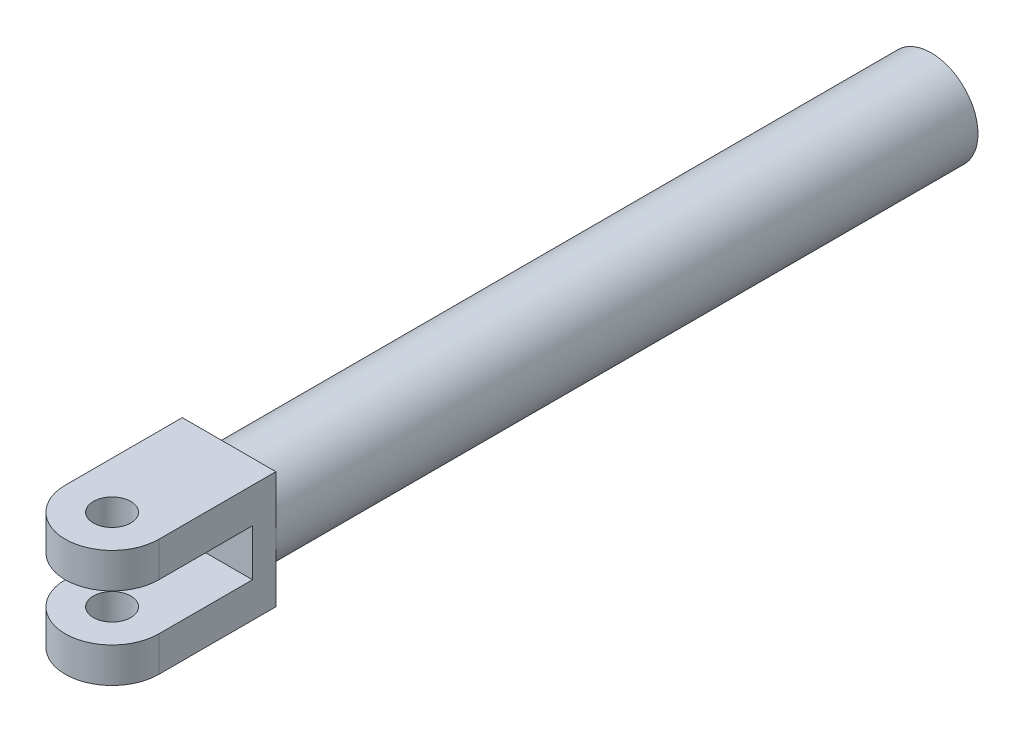
ISO-10303-21;
HEADER;
FILE_DESCRIPTION(('STEP AP214'),'2;1');
FILE_NAME('part.step','',(''),(''),'','','');
FILE_SCHEMA(('AUTOMOTIVE_DESIGN { 1 0 10303 214 1 1 1 1 }'));
ENDSEC;
DATA;
#1=APPLICATION_CONTEXT('core data for automotive mechanical design processes');
#2=APPLICATION_PROTOCOL_DEFINITION('international standard','automotive_design',2000,#1);
#3=PRODUCT_CONTEXT('',#1,'mechanical');
#4=PRODUCT('Part','Part','',(#3));
#5=PRODUCT_RELATED_PRODUCT_CATEGORY('part','',(#4));
#6=PRODUCT_DEFINITION_FORMATION('','',#4);
#7=PRODUCT_DEFINITION_CONTEXT('part definition',#1,'design');
#8=PRODUCT_DEFINITION('design','',#6,#7);
#9=PRODUCT_DEFINITION_SHAPE('','',#8);
#10=(LENGTH_UNIT() NAMED_UNIT(*) SI_UNIT(.MILLI.,.METRE.));
#11=(NAMED_UNIT(*) PLANE_ANGLE_UNIT() SI_UNIT($,.RADIAN.));
#12=(NAMED_UNIT(*) SI_UNIT($,.STERADIAN.) SOLID_ANGLE_UNIT());
#13=UNCERTAINTY_MEASURE_WITH_UNIT(LENGTH_MEASURE(1.E-05),#10,'distance_accuracy_value','');
#14=(GEOMETRIC_REPRESENTATION_CONTEXT(3) GLOBAL_UNCERTAINTY_ASSIGNED_CONTEXT((#13)) GLOBAL_UNIT_ASSIGNED_CONTEXT((#10,
#11,#12)) REPRESENTATION_CONTEXT('',''));
#15=CARTESIAN_POINT('',(0.,0.,0.));
#16=DIRECTION('',(0.,0.,1.));
#17=DIRECTION('',(1.,0.,0.));
#18=AXIS2_PLACEMENT_3D('',#15,#16,#17);
#19=CARTESIAN_POINT('',(0.,5.,175.));
#20=DIRECTION('',(0.,-1.,0.));
#21=DIRECTION('',(0.,0.,-1.));
#22=AXIS2_PLACEMENT_3D('',#19,#20,#21);
#23=CYLINDRICAL_SURFACE('',#22,10.);
#24=DIRECTION('',(0.,1.,0.));
#25=VECTOR('',#24,1.);
#26=CARTESIAN_POINT('',(-10.,5.,175.));
#27=LINE('',#26,#25);
#28=CARTESIAN_POINT('',(-10.,5.,175.));
#29=VERTEX_POINT('',#28);
#30=CARTESIAN_POINT('',(-10.,12.5,175.));
#31=VERTEX_POINT('',#30);
#32=EDGE_CURVE('E185',#29,#31,#27,.T.);
#33=ORIENTED_EDGE('',*,*,#32,.F.);
#34=CARTESIAN_POINT('',(0.,5.,175.));
#35=DIRECTION('',(0.,1.,0.));
#36=DIRECTION('',(0.,0.,1.));
#37=AXIS2_PLACEMENT_3D('',#34,#35,#36);
#38=CIRCLE('',#37,10.);
#39=CARTESIAN_POINT('',(10.,5.,175.));
#40=VERTEX_POINT('',#39);
#41=EDGE_CURVE('E46',#40,#29,#38,.F.);
#42=ORIENTED_EDGE('',*,*,#41,.F.);
#43=DIRECTION('',(0.,1.,0.));
#44=VECTOR('',#43,1.);
#45=CARTESIAN_POINT('',(10.,5.,175.));
#46=LINE('',#45,#44);
#47=CARTESIAN_POINT('',(10.,12.5,175.));
#48=VERTEX_POINT('',#47);
#49=EDGE_CURVE('E187',#48,#40,#46,.F.);
#50=ORIENTED_EDGE('',*,*,#49,.F.);
#51=CARTESIAN_POINT('',(0.,12.5,175.));
#52=DIRECTION('',(0.,-1.,0.));
#53=DIRECTION('',(0.,0.,-1.));
#54=AXIS2_PLACEMENT_3D('',#51,#52,#53);
#55=CIRCLE('',#54,10.);
#56=EDGE_CURVE('E11',#31,#48,#55,.F.);
#57=ORIENTED_EDGE('',*,*,#56,.F.);
#58=EDGE_LOOP('',(#33,#42,#50,#57));
#59=FACE_BOUND('',#58,.T.);
#60=ADVANCED_FACE('F38',(#59),#23,.T.);
#61=CARTESIAN_POINT('',(0.,-5.,175.));
#62=DIRECTION('',(0.,1.,0.));
#63=DIRECTION('',(0.,0.,1.));
#64=AXIS2_PLACEMENT_3D('',#61,#62,#63);
#65=CYLINDRICAL_SURFACE('',#64,10.);
#66=DIRECTION('',(0.,-1.,0.));
#67=VECTOR('',#66,1.);
#68=CARTESIAN_POINT('',(10.,-5.,175.));
#69=LINE('',#68,#67);
#70=CARTESIAN_POINT('',(10.,-5.,175.));
#71=VERTEX_POINT('',#70);
#72=CARTESIAN_POINT('',(10.,-12.5,175.));
#73=VERTEX_POINT('',#72);
#74=EDGE_CURVE('E168',#71,#73,#69,.T.);
#75=ORIENTED_EDGE('',*,*,#74,.F.);
#76=CARTESIAN_POINT('',(0.,-5.,175.));
#77=DIRECTION('',(0.,-1.,0.));
#78=DIRECTION('',(0.,0.,-1.));
#79=AXIS2_PLACEMENT_3D('',#76,#77,#78);
#80=CIRCLE('',#79,10.);
#81=CARTESIAN_POINT('',(-10.,-5.,175.));
#82=VERTEX_POINT('',#81);
#83=EDGE_CURVE('E181',#82,#71,#80,.F.);
#84=ORIENTED_EDGE('',*,*,#83,.F.);
#85=DIRECTION('',(0.,-1.,0.));
#86=VECTOR('',#85,1.);
#87=CARTESIAN_POINT('',(-10.,-5.,175.));
#88=LINE('',#87,#86);
#89=CARTESIAN_POINT('',(-10.,-12.5,175.));
#90=VERTEX_POINT('',#89);
#91=EDGE_CURVE('E179',#90,#82,#88,.F.);
#92=ORIENTED_EDGE('',*,*,#91,.F.);
#93=CARTESIAN_POINT('',(0.,-12.5,175.));
#94=DIRECTION('',(0.,1.,0.));
#95=DIRECTION('',(0.,0.,1.));
#96=AXIS2_PLACEMENT_3D('',#93,#94,#95);
#97=CIRCLE('',#96,10.);
#98=EDGE_CURVE('E183',#73,#90,#97,.F.);
#99=ORIENTED_EDGE('',*,*,#98,.F.);
#100=EDGE_LOOP('',(#75,#84,#92,#99));
#101=FACE_BOUND('',#100,.T.);
#102=ADVANCED_FACE('F212',(#101),#65,.T.);
#103=CARTESIAN_POINT('',(0.,0.,150.));
#104=DIRECTION('',(0.,0.,-1.));
#105=DIRECTION('',(-1.,0.,0.));
#106=AXIS2_PLACEMENT_3D('',#103,#104,#105);
#107=CYLINDRICAL_SURFACE('',#106,10.);
#108=CARTESIAN_POINT('',(0.,0.,150.));
#109=DIRECTION('',(0.,0.,1.));
#110=DIRECTION('',(1.,0.,0.));
#111=AXIS2_PLACEMENT_3D('',#108,#109,#110);
#112=CIRCLE('',#111,10.);
#113=CARTESIAN_POINT('',(10.,0.,150.));
#114=VERTEX_POINT('',#113);
#115=CARTESIAN_POINT('',(-10.,0.,150.));
#116=VERTEX_POINT('',#115);
#117=EDGE_CURVE('E165',#114,#116,#112,.T.);
#118=ORIENTED_EDGE('',*,*,#117,.F.);
#119=EDGE_CURVE('E169',#116,#114,#112,.T.);
#120=ORIENTED_EDGE('',*,*,#119,.F.);
#121=EDGE_LOOP('',(#118,#120));
#122=FACE_BOUND('',#121,.T.);
#123=CARTESIAN_POINT('',(0.,0.,0.));
#124=DIRECTION('',(0.,0.,1.));
#125=DIRECTION('',(1.,0.,0.));
#126=AXIS2_PLACEMENT_3D('',#123,#124,#125);
#127=CIRCLE('',#126,10.);
#128=CARTESIAN_POINT('',(10.,0.,0.));
#129=VERTEX_POINT('',#128);
#130=EDGE_CURVE('E164',#129,#129,#127,.T.);
#131=ORIENTED_EDGE('',*,*,#130,.T.);
#132=EDGE_LOOP('',(#131));
#133=FACE_BOUND('',#132,.T.);
#134=ADVANCED_FACE('F232',(#122,#133),#107,.T.);
#135=CARTESIAN_POINT('',(0.,0.,0.));
#136=DIRECTION('',(0.,0.,1.));
#137=DIRECTION('',(1.,0.,0.));
#138=AXIS2_PLACEMENT_3D('',#135,#136,#137);
#139=PLANE('',#138);
#140=ORIENTED_EDGE('',*,*,#130,.F.);
#141=EDGE_LOOP('',(#140));
#142=FACE_BOUND('',#141,.T.);
#143=ADVANCED_FACE('F236',(#142),#139,.F.);
#144=CARTESIAN_POINT('',(0.,0.,150.));
#145=DIRECTION('',(0.,0.,1.));
#146=DIRECTION('',(1.,0.,0.));
#147=AXIS2_PLACEMENT_3D('',#144,#145,#146);
#148=PLANE('',#147);
#149=DIRECTION('',(0.,1.,0.));
#150=VECTOR('',#149,1.);
#151=CARTESIAN_POINT('',(10.,12.5,150.));
#152=LINE('',#151,#150);
#153=CARTESIAN_POINT('',(10.,12.5,150.));
#154=VERTEX_POINT('',#153);
#155=EDGE_CURVE('E142',#114,#154,#152,.T.);
#156=ORIENTED_EDGE('',*,*,#155,.F.);
#157=ORIENTED_EDGE('',*,*,#117,.T.);
#158=DIRECTION('',(0.,-1.,0.));
#159=VECTOR('',#158,1.);
#160=CARTESIAN_POINT('',(-10.,12.5,150.));
#161=LINE('',#160,#159);
#162=CARTESIAN_POINT('',(-10.,12.5,150.));
#163=VERTEX_POINT('',#162);
#164=EDGE_CURVE('E150',#163,#116,#161,.T.);
#165=ORIENTED_EDGE('',*,*,#164,.F.);
#166=DIRECTION('',(-1.,0.,0.));
#167=VECTOR('',#166,1.);
#168=CARTESIAN_POINT('',(-10.,12.5,150.));
#169=LINE('',#168,#167);
#170=EDGE_CURVE('E146',#154,#163,#169,.T.);
#171=ORIENTED_EDGE('',*,*,#170,.F.);
#172=EDGE_LOOP('',(#156,#157,#165,#171));
#173=FACE_BOUND('',#172,.T.);
#174=ADVANCED_FACE('F197',(#173),#148,.F.);
#175=CARTESIAN_POINT('',(-10.,-12.5,150.));
#176=VERTEX_POINT('',#175);
#177=EDGE_CURVE('E149',#116,#176,#161,.T.);
#178=ORIENTED_EDGE('',*,*,#177,.F.);
#179=ORIENTED_EDGE('',*,*,#119,.T.);
#180=CARTESIAN_POINT('',(10.,-12.5,150.));
#181=VERTEX_POINT('',#180);
#182=EDGE_CURVE('E143',#181,#114,#152,.T.);
#183=ORIENTED_EDGE('',*,*,#182,.F.);
#184=DIRECTION('',(1.,0.,0.));
#185=VECTOR('',#184,1.);
#186=CARTESIAN_POINT('',(-10.,-12.5,150.));
#187=LINE('',#186,#185);
#188=EDGE_CURVE('E153',#176,#181,#187,.T.);
#189=ORIENTED_EDGE('',*,*,#188,.F.);
#190=EDGE_LOOP('',(#178,#179,#183,#189));
#191=FACE_BOUND('',#190,.T.);
#192=ADVANCED_FACE('F205',(#191),#148,.F.);
#193=CARTESIAN_POINT('',(10.,12.5,185.));
#194=DIRECTION('',(-1.,0.,0.));
#195=DIRECTION('',(0.,0.,1.));
#196=AXIS2_PLACEMENT_3D('',#193,#194,#195);
#197=PLANE('',#196);
#198=DIRECTION('',(0.,0.,-1.));
#199=VECTOR('',#198,1.);
#200=CARTESIAN_POINT('',(10.,12.5,185.));
#201=LINE('',#200,#199);
#202=EDGE_CURVE('E162',#48,#154,#201,.T.);
#203=ORIENTED_EDGE('',*,*,#202,.F.);
#204=ORIENTED_EDGE('',*,*,#49,.T.);
#205=DIRECTION('',(0.,0.,-1.));
#206=VECTOR('',#205,1.);
#207=CARTESIAN_POINT('',(10.,5.,185.));
#208=LINE('',#207,#206);
#209=CARTESIAN_POINT('',(10.,5.,155.));
#210=VERTEX_POINT('',#209);
#211=EDGE_CURVE('E135',#40,#210,#208,.T.);
#212=ORIENTED_EDGE('',*,*,#211,.T.);
#213=DIRECTION('',(0.,-1.,0.));
#214=VECTOR('',#213,1.);
#215=CARTESIAN_POINT('',(10.,12.5,155.));
#216=LINE('',#215,#214);
#217=CARTESIAN_POINT('',(10.,-5.,155.));
#218=VERTEX_POINT('',#217);
#219=EDGE_CURVE('E124',#210,#218,#216,.T.);
#220=ORIENTED_EDGE('',*,*,#219,.T.);
#221=DIRECTION('',(0.,0.,1.));
#222=VECTOR('',#221,1.);
#223=CARTESIAN_POINT('',(10.,-5.,185.));
#224=LINE('',#223,#222);
#225=EDGE_CURVE('E138',#218,#71,#224,.T.);
#226=ORIENTED_EDGE('',*,*,#225,.T.);
#227=ORIENTED_EDGE('',*,*,#74,.T.);
#228=DIRECTION('',(0.,0.,-1.));
#229=VECTOR('',#228,1.);
#230=CARTESIAN_POINT('',(10.,-12.5,185.));
#231=LINE('',#230,#229);
#232=EDGE_CURVE('E156',#73,#181,#231,.T.);
#233=ORIENTED_EDGE('',*,*,#232,.T.);
#234=ORIENTED_EDGE('',*,*,#182,.T.);
#235=ORIENTED_EDGE('',*,*,#155,.T.);
#236=EDGE_LOOP('',(#203,#204,#212,#220,#226,#227,#233,#234,#235));
#237=FACE_BOUND('',#236,.T.);
#238=ADVANCED_FACE('F190',(#237),#197,.F.);
#239=CARTESIAN_POINT('',(-10.,12.5,185.));
#240=DIRECTION('',(0.,-1.,0.));
#241=DIRECTION('',(0.,0.,-1.));
#242=AXIS2_PLACEMENT_3D('',#239,#240,#241);
#243=PLANE('',#242);
#244=CARTESIAN_POINT('',(0.,12.5,175.));
#245=DIRECTION('',(0.,-1.,0.));
#246=DIRECTION('',(0.,0.,-1.));
#247=AXIS2_PLACEMENT_3D('',#244,#245,#246);
#248=CIRCLE('',#247,4.);
#249=CARTESIAN_POINT('',(0.,12.5,171.));
#250=VERTEX_POINT('',#249);
#251=EDGE_CURVE('E115',#250,#250,#248,.T.);
#252=ORIENTED_EDGE('',*,*,#251,.T.);
#253=EDGE_LOOP('',(#252));
#254=FACE_BOUND('',#253,.T.);
#255=DIRECTION('',(0.,0.,-1.));
#256=VECTOR('',#255,1.);
#257=CARTESIAN_POINT('',(-10.,12.5,185.));
#258=LINE('',#257,#256);
#259=EDGE_CURVE('E160',#31,#163,#258,.T.);
#260=ORIENTED_EDGE('',*,*,#259,.F.);
#261=ORIENTED_EDGE('',*,*,#56,.T.);
#262=ORIENTED_EDGE('',*,*,#202,.T.);
#263=ORIENTED_EDGE('',*,*,#170,.T.);
#264=EDGE_LOOP('',(#260,#261,#262,#263));
#265=FACE_BOUND('',#264,.T.);
#266=ADVANCED_FACE('F192',(#254,#265),#243,.F.);
#267=CARTESIAN_POINT('',(-10.,12.5,185.));
#268=DIRECTION('',(1.,0.,0.));
#269=DIRECTION('',(0.,0.,-1.));
#270=AXIS2_PLACEMENT_3D('',#267,#268,#269);
#271=PLANE('',#270);
#272=DIRECTION('',(0.,0.,-1.));
#273=VECTOR('',#272,1.);
#274=CARTESIAN_POINT('',(-10.,5.,155.));
#275=LINE('',#274,#273);
#276=CARTESIAN_POINT('',(-10.,5.,155.));
#277=VERTEX_POINT('',#276);
#278=EDGE_CURVE('E106',#29,#277,#275,.T.);
#279=ORIENTED_EDGE('',*,*,#278,.F.);
#280=ORIENTED_EDGE('',*,*,#32,.T.);
#281=ORIENTED_EDGE('',*,*,#259,.T.);
#282=ORIENTED_EDGE('',*,*,#164,.T.);
#283=ORIENTED_EDGE('',*,*,#177,.T.);
#284=DIRECTION('',(0.,0.,-1.));
#285=VECTOR('',#284,1.);
#286=CARTESIAN_POINT('',(-10.,-12.5,185.));
#287=LINE('',#286,#285);
#288=EDGE_CURVE('E158',#90,#176,#287,.T.);
#289=ORIENTED_EDGE('',*,*,#288,.F.);
#290=ORIENTED_EDGE('',*,*,#91,.T.);
#291=DIRECTION('',(0.,0.,1.));
#292=VECTOR('',#291,1.);
#293=CARTESIAN_POINT('',(-10.,-5.,155.));
#294=LINE('',#293,#292);
#295=CARTESIAN_POINT('',(-10.,-5.,155.));
#296=VERTEX_POINT('',#295);
#297=EDGE_CURVE('E126',#296,#82,#294,.T.);
#298=ORIENTED_EDGE('',*,*,#297,.F.);
#299=DIRECTION('',(0.,-1.,0.));
#300=VECTOR('',#299,1.);
#301=CARTESIAN_POINT('',(-10.,5.,155.));
#302=LINE('',#301,#300);
#303=EDGE_CURVE('E114',#277,#296,#302,.T.);
#304=ORIENTED_EDGE('',*,*,#303,.F.);
#305=EDGE_LOOP('',(#279,#280,#281,#282,#283,#289,#290,#298,#304));
#306=FACE_BOUND('',#305,.T.);
#307=ADVANCED_FACE('F128',(#306),#271,.F.);
#308=CARTESIAN_POINT('',(-10.,-12.5,185.));
#309=DIRECTION('',(0.,1.,0.));
#310=DIRECTION('',(0.,0.,1.));
#311=AXIS2_PLACEMENT_3D('',#308,#309,#310);
#312=PLANE('',#311);
#313=CARTESIAN_POINT('',(0.,-12.5,175.));
#314=DIRECTION('',(0.,-1.,0.));
#315=DIRECTION('',(0.,0.,-1.));
#316=AXIS2_PLACEMENT_3D('',#313,#314,#315);
#317=CIRCLE('',#316,4.);
#318=CARTESIAN_POINT('',(0.,-12.5,171.));
#319=VERTEX_POINT('',#318);
#320=EDGE_CURVE('E176',#319,#319,#317,.T.);
#321=ORIENTED_EDGE('',*,*,#320,.F.);
#322=EDGE_LOOP('',(#321));
#323=FACE_BOUND('',#322,.T.);
#324=ORIENTED_EDGE('',*,*,#232,.F.);
#325=ORIENTED_EDGE('',*,*,#98,.T.);
#326=ORIENTED_EDGE('',*,*,#288,.T.);
#327=ORIENTED_EDGE('',*,*,#188,.T.);
#328=EDGE_LOOP('',(#324,#325,#326,#327));
#329=FACE_BOUND('',#328,.T.);
#330=ADVANCED_FACE('F208',(#323,#329),#312,.F.);
#331=CARTESIAN_POINT('',(40.,5.,155.));
#332=DIRECTION('',(0.,0.,-1.));
#333=DIRECTION('',(-1.,0.,0.));
#334=AXIS2_PLACEMENT_3D('',#331,#332,#333);
#335=PLANE('',#334);
#336=DIRECTION('',(-1.,0.,0.));
#337=VECTOR('',#336,1.);
#338=CARTESIAN_POINT('',(40.,5.,155.));
#339=LINE('',#338,#337);
#340=EDGE_CURVE('E110',#210,#277,#339,.T.);
#341=ORIENTED_EDGE('',*,*,#340,.T.);
#342=ORIENTED_EDGE('',*,*,#303,.T.);
#343=DIRECTION('',(-1.,0.,0.));
#344=VECTOR('',#343,1.);
#345=CARTESIAN_POINT('',(40.,-5.,155.));
#346=LINE('',#345,#344);
#347=EDGE_CURVE('E125',#218,#296,#346,.T.);
#348=ORIENTED_EDGE('',*,*,#347,.F.);
#349=ORIENTED_EDGE('',*,*,#219,.F.);
#350=EDGE_LOOP('',(#341,#342,#348,#349));
#351=FACE_BOUND('',#350,.T.);
#352=ADVANCED_FACE('F120',(#351),#335,.F.);
#353=CARTESIAN_POINT('',(40.,-5.,155.));
#354=DIRECTION('',(0.,-1.,0.));
#355=DIRECTION('',(0.,0.,-1.));
#356=AXIS2_PLACEMENT_3D('',#353,#354,#355);
#357=PLANE('',#356);
#358=CARTESIAN_POINT('',(0.,-5.,175.));
#359=DIRECTION('',(0.,-1.,0.));
#360=DIRECTION('',(0.,0.,-1.));
#361=AXIS2_PLACEMENT_3D('',#358,#359,#360);
#362=CIRCLE('',#361,4.);
#363=CARTESIAN_POINT('',(0.,-5.,171.));
#364=VERTEX_POINT('',#363);
#365=EDGE_CURVE('E175',#364,#364,#362,.T.);
#366=ORIENTED_EDGE('',*,*,#365,.T.);
#367=EDGE_LOOP('',(#366));
#368=FACE_BOUND('',#367,.T.);
#369=ORIENTED_EDGE('',*,*,#297,.T.);
#370=ORIENTED_EDGE('',*,*,#83,.T.);
#371=ORIENTED_EDGE('',*,*,#225,.F.);
#372=ORIENTED_EDGE('',*,*,#347,.T.);
#373=EDGE_LOOP('',(#369,#370,#371,#372));
#374=FACE_BOUND('',#373,.T.);
#375=ADVANCED_FACE('F214',(#368,#374),#357,.F.);
#376=CARTESIAN_POINT('',(40.,5.,155.));
#377=DIRECTION('',(0.,1.,0.));
#378=DIRECTION('',(0.,0.,1.));
#379=AXIS2_PLACEMENT_3D('',#376,#377,#378);
#380=PLANE('',#379);
#381=CARTESIAN_POINT('',(0.,5.,175.));
#382=DIRECTION('',(0.,1.,0.));
#383=DIRECTION('',(0.,0.,1.));
#384=AXIS2_PLACEMENT_3D('',#381,#382,#383);
#385=CIRCLE('',#384,4.);
#386=CARTESIAN_POINT('',(0.,5.,179.));
#387=VERTEX_POINT('',#386);
#388=EDGE_CURVE('E172',#387,#387,#385,.T.);
#389=ORIENTED_EDGE('',*,*,#388,.T.);
#390=EDGE_LOOP('',(#389));
#391=FACE_BOUND('',#390,.T.);
#392=ORIENTED_EDGE('',*,*,#211,.F.);
#393=ORIENTED_EDGE('',*,*,#41,.T.);
#394=ORIENTED_EDGE('',*,*,#278,.T.);
#395=ORIENTED_EDGE('',*,*,#340,.F.);
#396=EDGE_LOOP('',(#392,#393,#394,#395));
#397=FACE_BOUND('',#396,.T.);
#398=ADVANCED_FACE('F109',(#391,#397),#380,.F.);
#399=CARTESIAN_POINT('',(0.,37.5,175.));
#400=DIRECTION('',(0.,-1.,0.));
#401=DIRECTION('',(0.,0.,-1.));
#402=AXIS2_PLACEMENT_3D('',#399,#400,#401);
#403=CYLINDRICAL_SURFACE('',#402,4.);
#404=ORIENTED_EDGE('',*,*,#388,.F.);
#405=EDGE_LOOP('',(#404));
#406=FACE_BOUND('',#405,.T.);
#407=ORIENTED_EDGE('',*,*,#251,.F.);
#408=EDGE_LOOP('',(#407));
#409=FACE_BOUND('',#408,.T.);
#410=ADVANCED_FACE('F222',(#406,#409),#403,.F.);
#411=ORIENTED_EDGE('',*,*,#320,.T.);
#412=EDGE_LOOP('',(#411));
#413=FACE_BOUND('',#412,.T.);
#414=ORIENTED_EDGE('',*,*,#365,.F.);
#415=EDGE_LOOP('',(#414));
#416=FACE_BOUND('',#415,.T.);
#417=ADVANCED_FACE('F293',(#413,#416),#403,.F.);
#418=CLOSED_SHELL('',(#60,#102,#134,#143,#174,#192,#238,#266,#307,#330,#352,#375,#398,#410,#417));
#419=MANIFOLD_SOLID_BREP('B2',#418);
#420=ADVANCED_BREP_SHAPE_REPRESENTATION('',(#18,#419),#14);
#421=SHAPE_DEFINITION_REPRESENTATION(#9,#420);
ENDSEC;
END-ISO-10303-21;
